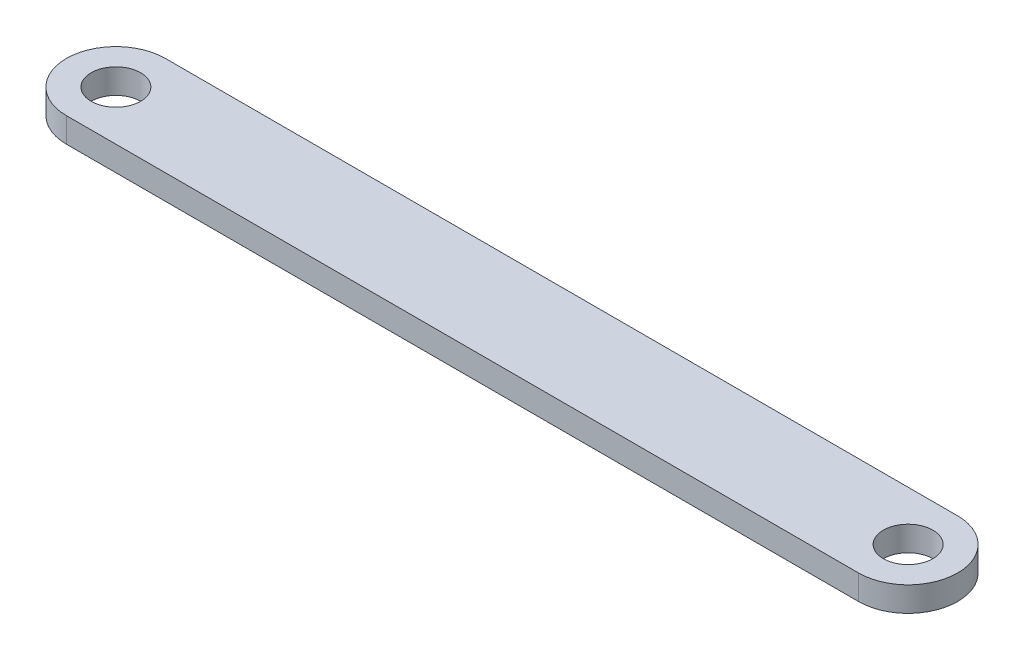
ISO-10303-21;
HEADER;
FILE_DESCRIPTION(('STEP AP214'),'2;1');
FILE_NAME('part.step','',(''),(''),'','','');
FILE_SCHEMA(('AUTOMOTIVE_DESIGN { 1 0 10303 214 1 1 1 1 }'));
ENDSEC;
DATA;
#1=APPLICATION_CONTEXT('core data for automotive mechanical design processes');
#2=APPLICATION_PROTOCOL_DEFINITION('international standard','automotive_design',2000,#1);
#3=PRODUCT_CONTEXT('',#1,'mechanical');
#4=PRODUCT('Part','Part','',(#3));
#5=PRODUCT_RELATED_PRODUCT_CATEGORY('part','',(#4));
#6=PRODUCT_DEFINITION_FORMATION('','',#4);
#7=PRODUCT_DEFINITION_CONTEXT('part definition',#1,'design');
#8=PRODUCT_DEFINITION('design','',#6,#7);
#9=PRODUCT_DEFINITION_SHAPE('','',#8);
#10=(LENGTH_UNIT() NAMED_UNIT(*) SI_UNIT(.MILLI.,.METRE.));
#11=(NAMED_UNIT(*) PLANE_ANGLE_UNIT() SI_UNIT($,.RADIAN.));
#12=(NAMED_UNIT(*) SI_UNIT($,.STERADIAN.) SOLID_ANGLE_UNIT());
#13=UNCERTAINTY_MEASURE_WITH_UNIT(LENGTH_MEASURE(1.E-05),#10,'distance_accuracy_value','');
#14=(GEOMETRIC_REPRESENTATION_CONTEXT(3) GLOBAL_UNCERTAINTY_ASSIGNED_CONTEXT((#13)) GLOBAL_UNIT_ASSIGNED_CONTEXT((#10,
#11,#12)) REPRESENTATION_CONTEXT('',''));
#15=CARTESIAN_POINT('',(0.,0.,0.));
#16=DIRECTION('',(0.,0.,1.));
#17=DIRECTION('',(1.,0.,0.));
#18=AXIS2_PLACEMENT_3D('',#15,#16,#17);
#19=CARTESIAN_POINT('',(-80.,5.,0.));
#20=DIRECTION('',(0.,1.,0.));
#21=DIRECTION('',(0.,0.,1.));
#22=AXIS2_PLACEMENT_3D('',#19,#20,#21);
#23=PLANE('',#22);
#24=CARTESIAN_POINT('',(-80.,5.,0.));
#25=DIRECTION('',(0.,1.,0.));
#26=DIRECTION('',(0.,0.,1.));
#27=AXIS2_PLACEMENT_3D('',#24,#25,#26);
#28=CIRCLE('',#27,5.);
#29=CARTESIAN_POINT('',(-80.,5.,5.00000000000001));
#30=VERTEX_POINT('',#29);
#31=EDGE_CURVE('E106',#30,#30,#28,.T.);
#32=ORIENTED_EDGE('',*,*,#31,.F.);
#33=EDGE_LOOP('',(#32));
#34=FACE_BOUND('',#33,.T.);
#35=CARTESIAN_POINT('',(-80.,5.,0.));
#36=DIRECTION('',(0.,1.,0.));
#37=DIRECTION('',(0.,0.,1.));
#38=AXIS2_PLACEMENT_3D('',#35,#36,#37);
#39=CIRCLE('',#38,10.);
#40=CARTESIAN_POINT('',(-80.,5.,-10.));
#41=VERTEX_POINT('',#40);
#42=CARTESIAN_POINT('',(-80.,5.,10.));
#43=VERTEX_POINT('',#42);
#44=EDGE_CURVE('E91',#41,#43,#39,.T.);
#45=ORIENTED_EDGE('',*,*,#44,.T.);
#46=DIRECTION('',(1.,0.,0.));
#47=VECTOR('',#46,1.);
#48=CARTESIAN_POINT('',(-80.,5.,10.));
#49=LINE('',#48,#47);
#50=CARTESIAN_POINT('',(80.,5.,10.));
#51=VERTEX_POINT('',#50);
#52=EDGE_CURVE('E86',#43,#51,#49,.T.);
#53=ORIENTED_EDGE('',*,*,#52,.T.);
#54=CARTESIAN_POINT('',(80.,5.,0.));
#55=DIRECTION('',(0.,1.,0.));
#56=DIRECTION('',(0.,0.,1.));
#57=AXIS2_PLACEMENT_3D('',#54,#55,#56);
#58=CIRCLE('',#57,10.);
#59=CARTESIAN_POINT('',(80.,5.,-10.));
#60=VERTEX_POINT('',#59);
#61=EDGE_CURVE('E89',#51,#60,#58,.T.);
#62=ORIENTED_EDGE('',*,*,#61,.T.);
#63=DIRECTION('',(-1.,0.,0.));
#64=VECTOR('',#63,1.);
#65=CARTESIAN_POINT('',(-80.,5.,-10.));
#66=LINE('',#65,#64);
#67=EDGE_CURVE('E56',#60,#41,#66,.T.);
#68=ORIENTED_EDGE('',*,*,#67,.T.);
#69=EDGE_LOOP('',(#45,#53,#62,#68));
#70=FACE_BOUND('',#69,.T.);
#71=CARTESIAN_POINT('',(80.,5.,0.));
#72=DIRECTION('',(0.,1.,0.));
#73=DIRECTION('',(0.,0.,1.));
#74=AXIS2_PLACEMENT_3D('',#71,#72,#73);
#75=CIRCLE('',#74,5.);
#76=CARTESIAN_POINT('',(80.,5.,5.00000000000001));
#77=VERTEX_POINT('',#76);
#78=EDGE_CURVE('E121',#77,#77,#75,.T.);
#79=ORIENTED_EDGE('',*,*,#78,.F.);
#80=EDGE_LOOP('',(#79));
#81=FACE_BOUND('',#80,.T.);
#82=ADVANCED_FACE('F39',(#34,#70,#81),#23,.T.);
#83=CARTESIAN_POINT('',(-80.,0.,0.));
#84=DIRECTION('',(0.,1.,0.));
#85=DIRECTION('',(0.,0.,1.));
#86=AXIS2_PLACEMENT_3D('',#83,#84,#85);
#87=PLANE('',#86);
#88=CARTESIAN_POINT('',(-80.,0.,0.));
#89=DIRECTION('',(0.,1.,0.));
#90=DIRECTION('',(0.,0.,1.));
#91=AXIS2_PLACEMENT_3D('',#88,#89,#90);
#92=CIRCLE('',#91,10.);
#93=CARTESIAN_POINT('',(-80.,0.,-10.));
#94=VERTEX_POINT('',#93);
#95=CARTESIAN_POINT('',(-80.,0.,10.));
#96=VERTEX_POINT('',#95);
#97=EDGE_CURVE('E103',#94,#96,#92,.T.);
#98=ORIENTED_EDGE('',*,*,#97,.F.);
#99=DIRECTION('',(-1.,0.,0.));
#100=VECTOR('',#99,1.);
#101=CARTESIAN_POINT('',(-80.,0.,-10.));
#102=LINE('',#101,#100);
#103=CARTESIAN_POINT('',(80.,0.,-10.));
#104=VERTEX_POINT('',#103);
#105=EDGE_CURVE('E79',#104,#94,#102,.T.);
#106=ORIENTED_EDGE('',*,*,#105,.F.);
#107=CARTESIAN_POINT('',(80.,0.,0.));
#108=DIRECTION('',(0.,1.,0.));
#109=DIRECTION('',(0.,0.,1.));
#110=AXIS2_PLACEMENT_3D('',#107,#108,#109);
#111=CIRCLE('',#110,10.);
#112=CARTESIAN_POINT('',(80.,0.,10.));
#113=VERTEX_POINT('',#112);
#114=EDGE_CURVE('E73',#113,#104,#111,.T.);
#115=ORIENTED_EDGE('',*,*,#114,.F.);
#116=DIRECTION('',(1.,0.,0.));
#117=VECTOR('',#116,1.);
#118=CARTESIAN_POINT('',(-80.,0.,10.));
#119=LINE('',#118,#117);
#120=EDGE_CURVE('E95',#96,#113,#119,.T.);
#121=ORIENTED_EDGE('',*,*,#120,.F.);
#122=EDGE_LOOP('',(#98,#106,#115,#121));
#123=FACE_BOUND('',#122,.T.);
#124=CARTESIAN_POINT('',(-80.,0.,0.));
#125=DIRECTION('',(0.,1.,0.));
#126=DIRECTION('',(0.,0.,1.));
#127=AXIS2_PLACEMENT_3D('',#124,#125,#126);
#128=CIRCLE('',#127,5.);
#129=CARTESIAN_POINT('',(-80.,0.,5.00000000000001));
#130=VERTEX_POINT('',#129);
#131=EDGE_CURVE('E118',#130,#130,#128,.T.);
#132=ORIENTED_EDGE('',*,*,#131,.T.);
#133=EDGE_LOOP('',(#132));
#134=FACE_BOUND('',#133,.T.);
#135=CARTESIAN_POINT('',(80.,0.,0.));
#136=DIRECTION('',(0.,1.,0.));
#137=DIRECTION('',(0.,0.,1.));
#138=AXIS2_PLACEMENT_3D('',#135,#136,#137);
#139=CIRCLE('',#138,5.);
#140=CARTESIAN_POINT('',(80.,0.,5.00000000000001));
#141=VERTEX_POINT('',#140);
#142=EDGE_CURVE('E124',#141,#141,#139,.T.);
#143=ORIENTED_EDGE('',*,*,#142,.T.);
#144=EDGE_LOOP('',(#143));
#145=FACE_BOUND('',#144,.T.);
#146=ADVANCED_FACE('F114',(#123,#134,#145),#87,.F.);
#147=CARTESIAN_POINT('',(-80.,5.,0.));
#148=DIRECTION('',(0.,-1.,0.));
#149=DIRECTION('',(0.,0.,-1.));
#150=AXIS2_PLACEMENT_3D('',#147,#148,#149);
#151=CYLINDRICAL_SURFACE('',#150,10.);
#152=ORIENTED_EDGE('',*,*,#97,.T.);
#153=DIRECTION('',(0.,-1.,0.));
#154=VECTOR('',#153,1.);
#155=CARTESIAN_POINT('',(-80.,5.,10.));
#156=LINE('',#155,#154);
#157=EDGE_CURVE('E11',#43,#96,#156,.T.);
#158=ORIENTED_EDGE('',*,*,#157,.F.);
#159=ORIENTED_EDGE('',*,*,#44,.F.);
#160=DIRECTION('',(0.,-1.,0.));
#161=VECTOR('',#160,1.);
#162=CARTESIAN_POINT('',(-80.,5.,-10.));
#163=LINE('',#162,#161);
#164=EDGE_CURVE('E99',#41,#94,#163,.T.);
#165=ORIENTED_EDGE('',*,*,#164,.T.);
#166=EDGE_LOOP('',(#152,#158,#159,#165));
#167=FACE_BOUND('',#166,.T.);
#168=ADVANCED_FACE('F41',(#167),#151,.T.);
#169=CARTESIAN_POINT('',(-80.,5.,10.));
#170=DIRECTION('',(0.,0.,-1.));
#171=DIRECTION('',(-1.,0.,0.));
#172=AXIS2_PLACEMENT_3D('',#169,#170,#171);
#173=PLANE('',#172);
#174=ORIENTED_EDGE('',*,*,#120,.T.);
#175=DIRECTION('',(0.,-1.,0.));
#176=VECTOR('',#175,1.);
#177=CARTESIAN_POINT('',(80.,5.,10.));
#178=LINE('',#177,#176);
#179=EDGE_CURVE('E48',#51,#113,#178,.T.);
#180=ORIENTED_EDGE('',*,*,#179,.F.);
#181=ORIENTED_EDGE('',*,*,#52,.F.);
#182=ORIENTED_EDGE('',*,*,#157,.T.);
#183=EDGE_LOOP('',(#174,#180,#181,#182));
#184=FACE_BOUND('',#183,.T.);
#185=ADVANCED_FACE('F94',(#184),#173,.F.);
#186=CARTESIAN_POINT('',(80.,5.,0.));
#187=DIRECTION('',(0.,-1.,0.));
#188=DIRECTION('',(0.,0.,-1.));
#189=AXIS2_PLACEMENT_3D('',#186,#187,#188);
#190=CYLINDRICAL_SURFACE('',#189,10.);
#191=ORIENTED_EDGE('',*,*,#114,.T.);
#192=DIRECTION('',(0.,-1.,0.));
#193=VECTOR('',#192,1.);
#194=CARTESIAN_POINT('',(80.,5.,-10.));
#195=LINE('',#194,#193);
#196=EDGE_CURVE('E96',#60,#104,#195,.T.);
#197=ORIENTED_EDGE('',*,*,#196,.F.);
#198=ORIENTED_EDGE('',*,*,#61,.F.);
#199=ORIENTED_EDGE('',*,*,#179,.T.);
#200=EDGE_LOOP('',(#191,#197,#198,#199));
#201=FACE_BOUND('',#200,.T.);
#202=ADVANCED_FACE('F97',(#201),#190,.T.);
#203=CARTESIAN_POINT('',(-80.,5.,-10.));
#204=DIRECTION('',(0.,0.,1.));
#205=DIRECTION('',(1.,0.,0.));
#206=AXIS2_PLACEMENT_3D('',#203,#204,#205);
#207=PLANE('',#206);
#208=ORIENTED_EDGE('',*,*,#105,.T.);
#209=ORIENTED_EDGE('',*,*,#164,.F.);
#210=ORIENTED_EDGE('',*,*,#67,.F.);
#211=ORIENTED_EDGE('',*,*,#196,.T.);
#212=EDGE_LOOP('',(#208,#209,#210,#211));
#213=FACE_BOUND('',#212,.T.);
#214=ADVANCED_FACE('F111',(#213),#207,.F.);
#215=CARTESIAN_POINT('',(-80.,5.,0.));
#216=DIRECTION('',(0.,-1.,0.));
#217=DIRECTION('',(0.,0.,-1.));
#218=AXIS2_PLACEMENT_3D('',#215,#216,#217);
#219=CYLINDRICAL_SURFACE('',#218,5.);
#220=ORIENTED_EDGE('',*,*,#31,.T.);
#221=EDGE_LOOP('',(#220));
#222=FACE_BOUND('',#221,.T.);
#223=ORIENTED_EDGE('',*,*,#131,.F.);
#224=EDGE_LOOP('',(#223));
#225=FACE_BOUND('',#224,.T.);
#226=ADVANCED_FACE('F141',(#222,#225),#219,.F.);
#227=CARTESIAN_POINT('',(80.,5.,0.));
#228=DIRECTION('',(0.,-1.,0.));
#229=DIRECTION('',(0.,0.,-1.));
#230=AXIS2_PLACEMENT_3D('',#227,#228,#229);
#231=CYLINDRICAL_SURFACE('',#230,5.);
#232=ORIENTED_EDGE('',*,*,#78,.T.);
#233=EDGE_LOOP('',(#232));
#234=FACE_BOUND('',#233,.T.);
#235=ORIENTED_EDGE('',*,*,#142,.F.);
#236=EDGE_LOOP('',(#235));
#237=FACE_BOUND('',#236,.T.);
#238=ADVANCED_FACE('F130',(#234,#237),#231,.F.);
#239=CLOSED_SHELL('',(#82,#146,#168,#185,#202,#214,#226,#238));
#240=MANIFOLD_SOLID_BREP('B2',#239);
#241=ADVANCED_BREP_SHAPE_REPRESENTATION('',(#18,#240),#14);
#242=SHAPE_DEFINITION_REPRESENTATION(#9,#241);
ENDSEC;
END-ISO-10303-21;
